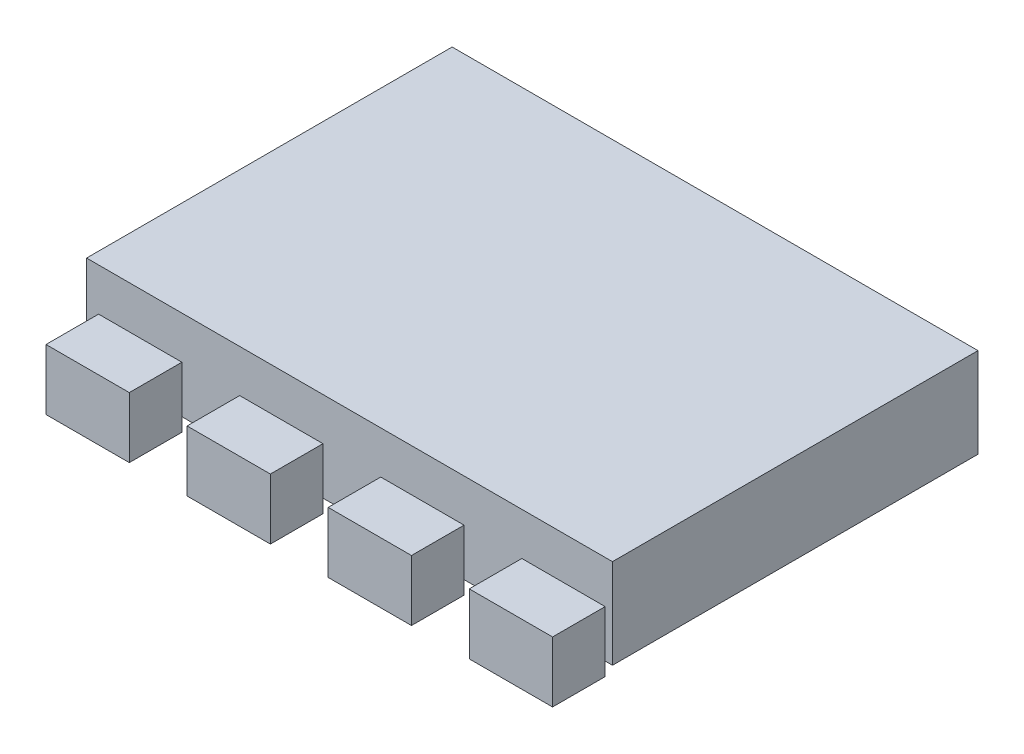
ISO-10303-21;
HEADER;
FILE_DESCRIPTION(('STEP AP214'),'2;1');
FILE_NAME('part.step','',(''),(''),'','','');
FILE_SCHEMA(('AUTOMOTIVE_DESIGN { 1 0 10303 214 1 1 1 1 }'));
ENDSEC;
DATA;
#1=APPLICATION_CONTEXT('core data for automotive mechanical design processes');
#2=APPLICATION_PROTOCOL_DEFINITION('international standard','automotive_design',2000,#1);
#3=PRODUCT_CONTEXT('',#1,'mechanical');
#4=PRODUCT('Part','Part','',(#3));
#5=PRODUCT_RELATED_PRODUCT_CATEGORY('part','',(#4));
#6=PRODUCT_DEFINITION_FORMATION('','',#4);
#7=PRODUCT_DEFINITION_CONTEXT('part definition',#1,'design');
#8=PRODUCT_DEFINITION('design','',#6,#7);
#9=PRODUCT_DEFINITION_SHAPE('','',#8);
#10=(LENGTH_UNIT() NAMED_UNIT(*) SI_UNIT(.MILLI.,.METRE.));
#11=(NAMED_UNIT(*) PLANE_ANGLE_UNIT() SI_UNIT($,.RADIAN.));
#12=(NAMED_UNIT(*) SI_UNIT($,.STERADIAN.) SOLID_ANGLE_UNIT());
#13=UNCERTAINTY_MEASURE_WITH_UNIT(LENGTH_MEASURE(1.E-05),#10,'distance_accuracy_value','');
#14=(GEOMETRIC_REPRESENTATION_CONTEXT(3) GLOBAL_UNCERTAINTY_ASSIGNED_CONTEXT((#13)) GLOBAL_UNIT_ASSIGNED_CONTEXT((#10,
#11,#12)) REPRESENTATION_CONTEXT('',''));
#15=CARTESIAN_POINT('',(0.,0.,0.));
#16=DIRECTION('',(0.,0.,1.));
#17=DIRECTION('',(1.,0.,0.));
#18=AXIS2_PLACEMENT_3D('',#15,#16,#17);
#19=CARTESIAN_POINT('',(-41.,14.,28.5));
#20=DIRECTION('',(0.,0.,-1.));
#21=DIRECTION('',(-1.,0.,0.));
#22=AXIS2_PLACEMENT_3D('',#19,#20,#21);
#23=PLANE('',#22);
#24=DIRECTION('',(0.,1.,0.));
#25=VECTOR('',#24,1.);
#26=CARTESIAN_POINT('',(39.8599380478354,-2.10091113978716,28.5));
#27=LINE('',#26,#25);
#28=CARTESIAN_POINT('',(39.8599380478354,0.,28.5));
#29=VERTEX_POINT('',#28);
#30=CARTESIAN_POINT('',(39.8599380478354,7.36082907602701,28.5));
#31=VERTEX_POINT('',#30);
#32=EDGE_CURVE('E223',#29,#31,#27,.T.);
#33=ORIENTED_EDGE('',*,*,#32,.F.);
#34=DIRECTION('',(1.,0.,0.));
#35=VECTOR('',#34,1.);
#36=CARTESIAN_POINT('',(-41.,0.,28.5));
#37=LINE('',#36,#35);
#38=CARTESIAN_POINT('',(41.,0.,28.5));
#39=VERTEX_POINT('',#38);
#40=EDGE_CURVE('E347',#29,#39,#37,.T.);
#41=ORIENTED_EDGE('',*,*,#40,.T.);
#42=DIRECTION('',(0.,-1.,0.));
#43=VECTOR('',#42,1.);
#44=CARTESIAN_POINT('',(41.,14.,28.5));
#45=LINE('',#44,#43);
#46=CARTESIAN_POINT('',(41.,14.,28.5));
#47=VERTEX_POINT('',#46);
#48=EDGE_CURVE('E340',#47,#39,#45,.T.);
#49=ORIENTED_EDGE('',*,*,#48,.F.);
#50=DIRECTION('',(1.,0.,0.));
#51=VECTOR('',#50,1.);
#52=CARTESIAN_POINT('',(-41.,14.,28.5));
#53=LINE('',#52,#51);
#54=CARTESIAN_POINT('',(-41.,14.,28.5));
#55=VERTEX_POINT('',#54);
#56=EDGE_CURVE('E338',#55,#47,#53,.T.);
#57=ORIENTED_EDGE('',*,*,#56,.F.);
#58=DIRECTION('',(0.,-1.,0.));
#59=VECTOR('',#58,1.);
#60=CARTESIAN_POINT('',(-41.,14.,28.5));
#61=LINE('',#60,#59);
#62=CARTESIAN_POINT('',(-41.,0.,28.5));
#63=VERTEX_POINT('',#62);
#64=EDGE_CURVE('E353',#55,#63,#61,.T.);
#65=ORIENTED_EDGE('',*,*,#64,.T.);
#66=CARTESIAN_POINT('',(-39.1299086891298,0.,28.5));
#67=VERTEX_POINT('',#66);
#68=EDGE_CURVE('E334',#63,#67,#37,.T.);
#69=ORIENTED_EDGE('',*,*,#68,.T.);
#70=DIRECTION('',(0.,-1.,0.));
#71=VECTOR('',#70,1.);
#72=CARTESIAN_POINT('',(-39.1299086891298,-2.10091113978716,28.5));
#73=LINE('',#72,#71);
#74=CARTESIAN_POINT('',(-39.1299086891298,7.36082907602701,28.5));
#75=VERTEX_POINT('',#74);
#76=EDGE_CURVE('E314',#75,#67,#73,.T.);
#77=ORIENTED_EDGE('',*,*,#76,.F.);
#78=DIRECTION('',(-1.,0.,0.));
#79=VECTOR('',#78,1.);
#80=CARTESIAN_POINT('',(-39.1299086891298,7.36082907602701,28.5));
#81=LINE('',#80,#79);
#82=CARTESIAN_POINT('',(-26.1400619521646,7.36082907602701,28.5));
#83=VERTEX_POINT('',#82);
#84=EDGE_CURVE('E310',#83,#75,#81,.T.);
#85=ORIENTED_EDGE('',*,*,#84,.F.);
#86=DIRECTION('',(0.,1.,0.));
#87=VECTOR('',#86,1.);
#88=CARTESIAN_POINT('',(-26.1400619521646,-2.10091113978716,28.5));
#89=LINE('',#88,#87);
#90=CARTESIAN_POINT('',(-26.1400619521646,0.,28.5));
#91=VERTEX_POINT('',#90);
#92=EDGE_CURVE('E11',#91,#83,#89,.T.);
#93=ORIENTED_EDGE('',*,*,#92,.F.);
#94=CARTESIAN_POINT('',(-17.1299086891298,0.,28.5));
#95=VERTEX_POINT('',#94);
#96=EDGE_CURVE('E716',#91,#95,#37,.T.);
#97=ORIENTED_EDGE('',*,*,#96,.T.);
#98=DIRECTION('',(0.,-1.,0.));
#99=VECTOR('',#98,1.);
#100=CARTESIAN_POINT('',(-17.1299086891298,-2.10091113978716,28.5));
#101=LINE('',#100,#99);
#102=CARTESIAN_POINT('',(-17.1299086891298,7.36082907602701,28.5));
#103=VERTEX_POINT('',#102);
#104=EDGE_CURVE('E283',#103,#95,#101,.T.);
#105=ORIENTED_EDGE('',*,*,#104,.F.);
#106=DIRECTION('',(-1.,0.,0.));
#107=VECTOR('',#106,1.);
#108=CARTESIAN_POINT('',(-17.1299086891298,7.36082907602701,28.5));
#109=LINE('',#108,#107);
#110=CARTESIAN_POINT('',(-4.14006195216458,7.36082907602701,28.5));
#111=VERTEX_POINT('',#110);
#112=EDGE_CURVE('E279',#111,#103,#109,.T.);
#113=ORIENTED_EDGE('',*,*,#112,.F.);
#114=DIRECTION('',(0.,1.,0.));
#115=VECTOR('',#114,1.);
#116=CARTESIAN_POINT('',(-4.14006195216458,-2.10091113978716,28.5));
#117=LINE('',#116,#115);
#118=CARTESIAN_POINT('',(-4.14006195216458,0.,28.5));
#119=VERTEX_POINT('',#118);
#120=EDGE_CURVE('E264',#119,#111,#117,.T.);
#121=ORIENTED_EDGE('',*,*,#120,.F.);
#122=CARTESIAN_POINT('',(4.8700913108702,0.,28.5));
#123=VERTEX_POINT('',#122);
#124=EDGE_CURVE('E709',#119,#123,#37,.T.);
#125=ORIENTED_EDGE('',*,*,#124,.T.);
#126=DIRECTION('',(0.,-1.,0.));
#127=VECTOR('',#126,1.);
#128=CARTESIAN_POINT('',(4.8700913108702,-2.10091113978716,28.5));
#129=LINE('',#128,#127);
#130=CARTESIAN_POINT('',(4.8700913108702,7.36082907602701,28.5));
#131=VERTEX_POINT('',#130);
#132=EDGE_CURVE('E249',#131,#123,#129,.T.);
#133=ORIENTED_EDGE('',*,*,#132,.F.);
#134=DIRECTION('',(-1.,0.,0.));
#135=VECTOR('',#134,1.);
#136=CARTESIAN_POINT('',(4.8700913108702,7.36082907602701,28.5));
#137=LINE('',#136,#135);
#138=CARTESIAN_POINT('',(17.8599380478354,7.36082907602701,28.5));
#139=VERTEX_POINT('',#138);
#140=EDGE_CURVE('E245',#139,#131,#137,.T.);
#141=ORIENTED_EDGE('',*,*,#140,.F.);
#142=DIRECTION('',(0.,1.,0.));
#143=VECTOR('',#142,1.);
#144=CARTESIAN_POINT('',(17.8599380478354,-2.10091113978716,28.5));
#145=LINE('',#144,#143);
#146=CARTESIAN_POINT('',(17.8599380478354,0.,28.5));
#147=VERTEX_POINT('',#146);
#148=EDGE_CURVE('E224',#147,#139,#145,.T.);
#149=ORIENTED_EDGE('',*,*,#148,.F.);
#150=CARTESIAN_POINT('',(26.8700913108702,0.,28.5));
#151=VERTEX_POINT('',#150);
#152=EDGE_CURVE('E705',#147,#151,#37,.T.);
#153=ORIENTED_EDGE('',*,*,#152,.T.);
#154=DIRECTION('',(0.,-1.,0.));
#155=VECTOR('',#154,1.);
#156=CARTESIAN_POINT('',(26.8700913108702,-2.10091113978716,28.5));
#157=LINE('',#156,#155);
#158=CARTESIAN_POINT('',(26.8700913108702,7.36082907602701,28.5));
#159=VERTEX_POINT('',#158);
#160=EDGE_CURVE('E59',#159,#151,#157,.T.);
#161=ORIENTED_EDGE('',*,*,#160,.F.);
#162=DIRECTION('',(-1.,0.,0.));
#163=VECTOR('',#162,1.);
#164=CARTESIAN_POINT('',(26.8700913108702,7.36082907602701,28.5));
#165=LINE('',#164,#163);
#166=EDGE_CURVE('E54',#31,#159,#165,.T.);
#167=ORIENTED_EDGE('',*,*,#166,.F.);
#168=EDGE_LOOP('',(#33,#41,#49,#57,#65,#69,#77,#85,#93,#97,#105,#113,#121,#125,#133,#141,#149,
#153,#161,#167));
#169=FACE_BOUND('',#168,.T.);
#170=ADVANCED_FACE('F37',(#169),#23,.F.);
#171=CARTESIAN_POINT('',(41.,14.,28.5));
#172=DIRECTION('',(-1.,0.,0.));
#173=DIRECTION('',(0.,0.,1.));
#174=AXIS2_PLACEMENT_3D('',#171,#172,#173);
#175=PLANE('',#174);
#176=DIRECTION('',(0.,0.,-1.));
#177=VECTOR('',#176,1.);
#178=CARTESIAN_POINT('',(41.,0.,28.5));
#179=LINE('',#178,#177);
#180=CARTESIAN_POINT('',(41.,0.,-28.5));
#181=VERTEX_POINT('',#180);
#182=EDGE_CURVE('E329',#39,#181,#179,.T.);
#183=ORIENTED_EDGE('',*,*,#182,.T.);
#184=DIRECTION('',(0.,-1.,0.));
#185=VECTOR('',#184,1.);
#186=CARTESIAN_POINT('',(41.,14.,-28.5));
#187=LINE('',#186,#185);
#188=CARTESIAN_POINT('',(41.,14.,-28.5));
#189=VERTEX_POINT('',#188);
#190=EDGE_CURVE('E41',#189,#181,#187,.T.);
#191=ORIENTED_EDGE('',*,*,#190,.F.);
#192=DIRECTION('',(0.,0.,-1.));
#193=VECTOR('',#192,1.);
#194=CARTESIAN_POINT('',(41.,14.,28.5));
#195=LINE('',#194,#193);
#196=EDGE_CURVE('E330',#47,#189,#195,.T.);
#197=ORIENTED_EDGE('',*,*,#196,.F.);
#198=ORIENTED_EDGE('',*,*,#48,.T.);
#199=EDGE_LOOP('',(#183,#191,#197,#198));
#200=FACE_BOUND('',#199,.T.);
#201=ADVANCED_FACE('F39',(#200),#175,.F.);
#202=CARTESIAN_POINT('',(-41.,14.,-28.5));
#203=DIRECTION('',(0.,0.,1.));
#204=DIRECTION('',(1.,0.,0.));
#205=AXIS2_PLACEMENT_3D('',#202,#203,#204);
#206=PLANE('',#205);
#207=DIRECTION('',(-1.,0.,0.));
#208=VECTOR('',#207,1.);
#209=CARTESIAN_POINT('',(-41.,0.,-28.5));
#210=LINE('',#209,#208);
#211=CARTESIAN_POINT('',(-41.,0.,-28.5));
#212=VERTEX_POINT('',#211);
#213=EDGE_CURVE('E343',#181,#212,#210,.T.);
#214=ORIENTED_EDGE('',*,*,#213,.T.);
#215=DIRECTION('',(0.,-1.,0.));
#216=VECTOR('',#215,1.);
#217=CARTESIAN_POINT('',(-41.,14.,-28.5));
#218=LINE('',#217,#216);
#219=CARTESIAN_POINT('',(-41.,14.,-28.5));
#220=VERTEX_POINT('',#219);
#221=EDGE_CURVE('E355',#220,#212,#218,.T.);
#222=ORIENTED_EDGE('',*,*,#221,.F.);
#223=DIRECTION('',(-1.,0.,0.));
#224=VECTOR('',#223,1.);
#225=CARTESIAN_POINT('',(-41.,14.,-28.5));
#226=LINE('',#225,#224);
#227=EDGE_CURVE('E333',#189,#220,#226,.T.);
#228=ORIENTED_EDGE('',*,*,#227,.F.);
#229=ORIENTED_EDGE('',*,*,#190,.T.);
#230=EDGE_LOOP('',(#214,#222,#228,#229));
#231=FACE_BOUND('',#230,.T.);
#232=ADVANCED_FACE('F364',(#231),#206,.F.);
#233=CARTESIAN_POINT('',(-41.,14.,28.5));
#234=DIRECTION('',(1.,0.,0.));
#235=DIRECTION('',(0.,0.,-1.));
#236=AXIS2_PLACEMENT_3D('',#233,#234,#235);
#237=PLANE('',#236);
#238=DIRECTION('',(0.,0.,1.));
#239=VECTOR('',#238,1.);
#240=CARTESIAN_POINT('',(-41.,0.,28.5));
#241=LINE('',#240,#239);
#242=EDGE_CURVE('E345',#212,#63,#241,.T.);
#243=ORIENTED_EDGE('',*,*,#242,.T.);
#244=ORIENTED_EDGE('',*,*,#64,.F.);
#245=DIRECTION('',(0.,0.,1.));
#246=VECTOR('',#245,1.);
#247=CARTESIAN_POINT('',(-41.,14.,28.5));
#248=LINE('',#247,#246);
#249=EDGE_CURVE('E336',#220,#55,#248,.T.);
#250=ORIENTED_EDGE('',*,*,#249,.F.);
#251=ORIENTED_EDGE('',*,*,#221,.T.);
#252=EDGE_LOOP('',(#243,#244,#250,#251));
#253=FACE_BOUND('',#252,.T.);
#254=ADVANCED_FACE('F373',(#253),#237,.F.);
#255=CARTESIAN_POINT('',(0.,14.,0.));
#256=DIRECTION('',(0.,-1.,0.));
#257=DIRECTION('',(0.,0.,-1.));
#258=AXIS2_PLACEMENT_3D('',#255,#256,#257);
#259=PLANE('',#258);
#260=ORIENTED_EDGE('',*,*,#196,.T.);
#261=ORIENTED_EDGE('',*,*,#227,.T.);
#262=ORIENTED_EDGE('',*,*,#249,.T.);
#263=ORIENTED_EDGE('',*,*,#56,.T.);
#264=EDGE_LOOP('',(#260,#261,#262,#263));
#265=FACE_BOUND('',#264,.T.);
#266=ADVANCED_FACE('F377',(#265),#259,.F.);
#267=CARTESIAN_POINT('',(0.,0.,0.));
#268=DIRECTION('',(0.,-1.,0.));
#269=DIRECTION('',(0.,0.,-1.));
#270=AXIS2_PLACEMENT_3D('',#267,#268,#269);
#271=PLANE('',#270);
#272=ORIENTED_EDGE('',*,*,#182,.F.);
#273=ORIENTED_EDGE('',*,*,#40,.F.);
#274=EDGE_CURVE('E693',#151,#29,#37,.T.);
#275=ORIENTED_EDGE('',*,*,#274,.F.);
#276=ORIENTED_EDGE('',*,*,#152,.F.);
#277=EDGE_CURVE('E706',#123,#147,#37,.T.);
#278=ORIENTED_EDGE('',*,*,#277,.F.);
#279=ORIENTED_EDGE('',*,*,#124,.F.);
#280=EDGE_CURVE('E713',#95,#119,#37,.T.);
#281=ORIENTED_EDGE('',*,*,#280,.F.);
#282=ORIENTED_EDGE('',*,*,#96,.F.);
#283=EDGE_CURVE('E350',#67,#91,#37,.T.);
#284=ORIENTED_EDGE('',*,*,#283,.F.);
#285=ORIENTED_EDGE('',*,*,#68,.F.);
#286=ORIENTED_EDGE('',*,*,#242,.F.);
#287=ORIENTED_EDGE('',*,*,#213,.F.);
#288=EDGE_LOOP('',(#272,#273,#275,#276,#278,#279,#281,#282,#284,#285,#286,#287));
#289=FACE_BOUND('',#288,.T.);
#290=ADVANCED_FACE('F370',(#289),#271,.T.);
#291=CARTESIAN_POINT('',(-26.1400619521646,-2.10091113978716,36.7));
#292=DIRECTION('',(-1.,0.,0.));
#293=DIRECTION('',(0.,0.,1.));
#294=AXIS2_PLACEMENT_3D('',#291,#292,#293);
#295=PLANE('',#294);
#296=CARTESIAN_POINT('',(-26.1400619521646,-2.10091113978716,28.5));
#297=VERTEX_POINT('',#296);
#298=EDGE_CURVE('E47',#297,#91,#89,.T.);
#299=ORIENTED_EDGE('',*,*,#298,.T.);
#300=ORIENTED_EDGE('',*,*,#92,.T.);
#301=DIRECTION('',(0.,0.,-1.));
#302=VECTOR('',#301,1.);
#303=CARTESIAN_POINT('',(-26.1400619521646,7.36082907602701,36.7));
#304=LINE('',#303,#302);
#305=CARTESIAN_POINT('',(-26.1400619521646,7.36082907602701,36.7));
#306=VERTEX_POINT('',#305);
#307=EDGE_CURVE('E326',#306,#83,#304,.T.);
#308=ORIENTED_EDGE('',*,*,#307,.F.);
#309=DIRECTION('',(0.,1.,0.));
#310=VECTOR('',#309,1.);
#311=CARTESIAN_POINT('',(-26.1400619521646,-2.10091113978716,36.7));
#312=LINE('',#311,#310);
#313=CARTESIAN_POINT('',(-26.1400619521646,-2.10091113978716,36.7));
#314=VERTEX_POINT('',#313);
#315=EDGE_CURVE('E298',#314,#306,#312,.T.);
#316=ORIENTED_EDGE('',*,*,#315,.F.);
#317=DIRECTION('',(0.,0.,-1.));
#318=VECTOR('',#317,1.);
#319=CARTESIAN_POINT('',(-26.1400619521646,-2.10091113978716,36.7));
#320=LINE('',#319,#318);
#321=EDGE_CURVE('E307',#314,#297,#320,.T.);
#322=ORIENTED_EDGE('',*,*,#321,.T.);
#323=EDGE_LOOP('',(#299,#300,#308,#316,#322));
#324=FACE_BOUND('',#323,.T.);
#325=ADVANCED_FACE('F385',(#324),#295,.F.);
#326=CARTESIAN_POINT('',(-39.1299086891298,7.36082907602701,36.7));
#327=DIRECTION('',(0.,-1.,0.));
#328=DIRECTION('',(0.,0.,-1.));
#329=AXIS2_PLACEMENT_3D('',#326,#327,#328);
#330=PLANE('',#329);
#331=ORIENTED_EDGE('',*,*,#84,.T.);
#332=DIRECTION('',(0.,0.,-1.));
#333=VECTOR('',#332,1.);
#334=CARTESIAN_POINT('',(-39.1299086891298,7.36082907602701,36.7));
#335=LINE('',#334,#333);
#336=CARTESIAN_POINT('',(-39.1299086891298,7.36082907602701,36.7));
#337=VERTEX_POINT('',#336);
#338=EDGE_CURVE('E323',#337,#75,#335,.T.);
#339=ORIENTED_EDGE('',*,*,#338,.F.);
#340=DIRECTION('',(-1.,0.,0.));
#341=VECTOR('',#340,1.);
#342=CARTESIAN_POINT('',(-39.1299086891298,7.36082907602701,36.7));
#343=LINE('',#342,#341);
#344=EDGE_CURVE('E301',#306,#337,#343,.T.);
#345=ORIENTED_EDGE('',*,*,#344,.F.);
#346=ORIENTED_EDGE('',*,*,#307,.T.);
#347=EDGE_LOOP('',(#331,#339,#345,#346));
#348=FACE_BOUND('',#347,.T.);
#349=ADVANCED_FACE('F418',(#348),#330,.F.);
#350=CARTESIAN_POINT('',(-39.1299086891298,-2.10091113978716,36.7));
#351=DIRECTION('',(1.,0.,0.));
#352=DIRECTION('',(0.,0.,-1.));
#353=AXIS2_PLACEMENT_3D('',#350,#351,#352);
#354=PLANE('',#353);
#355=ORIENTED_EDGE('',*,*,#76,.T.);
#356=CARTESIAN_POINT('',(-39.1299086891298,-2.10091113978716,28.5));
#357=VERTEX_POINT('',#356);
#358=EDGE_CURVE('E313',#67,#357,#73,.T.);
#359=ORIENTED_EDGE('',*,*,#358,.T.);
#360=DIRECTION('',(0.,0.,-1.));
#361=VECTOR('',#360,1.);
#362=CARTESIAN_POINT('',(-39.1299086891298,-2.10091113978716,36.7));
#363=LINE('',#362,#361);
#364=CARTESIAN_POINT('',(-39.1299086891298,-2.10091113978716,36.7));
#365=VERTEX_POINT('',#364);
#366=EDGE_CURVE('E320',#365,#357,#363,.T.);
#367=ORIENTED_EDGE('',*,*,#366,.F.);
#368=DIRECTION('',(0.,-1.,0.));
#369=VECTOR('',#368,1.);
#370=CARTESIAN_POINT('',(-39.1299086891298,-2.10091113978716,36.7));
#371=LINE('',#370,#369);
#372=EDGE_CURVE('E304',#337,#365,#371,.T.);
#373=ORIENTED_EDGE('',*,*,#372,.F.);
#374=ORIENTED_EDGE('',*,*,#338,.T.);
#375=EDGE_LOOP('',(#355,#359,#367,#373,#374));
#376=FACE_BOUND('',#375,.T.);
#377=ADVANCED_FACE('F427',(#376),#354,.F.);
#378=CARTESIAN_POINT('',(-39.1299086891298,-2.10091113978716,36.7));
#379=DIRECTION('',(0.,1.,0.));
#380=DIRECTION('',(0.,0.,1.));
#381=AXIS2_PLACEMENT_3D('',#378,#379,#380);
#382=PLANE('',#381);
#383=DIRECTION('',(1.,0.,0.));
#384=VECTOR('',#383,1.);
#385=CARTESIAN_POINT('',(-39.1299086891298,-2.10091113978716,28.5));
#386=LINE('',#385,#384);
#387=EDGE_CURVE('E302',#357,#297,#386,.T.);
#388=ORIENTED_EDGE('',*,*,#387,.T.);
#389=ORIENTED_EDGE('',*,*,#321,.F.);
#390=DIRECTION('',(1.,0.,0.));
#391=VECTOR('',#390,1.);
#392=CARTESIAN_POINT('',(-39.1299086891298,-2.10091113978716,36.7));
#393=LINE('',#392,#391);
#394=EDGE_CURVE('E306',#365,#314,#393,.T.);
#395=ORIENTED_EDGE('',*,*,#394,.F.);
#396=ORIENTED_EDGE('',*,*,#366,.T.);
#397=EDGE_LOOP('',(#388,#389,#395,#396));
#398=FACE_BOUND('',#397,.T.);
#399=ADVANCED_FACE('F437',(#398),#382,.F.);
#400=CARTESIAN_POINT('',(0.,0.,36.7));
#401=DIRECTION('',(0.,0.,-1.));
#402=DIRECTION('',(-1.,0.,0.));
#403=AXIS2_PLACEMENT_3D('',#400,#401,#402);
#404=PLANE('',#403);
#405=ORIENTED_EDGE('',*,*,#315,.T.);
#406=ORIENTED_EDGE('',*,*,#344,.T.);
#407=ORIENTED_EDGE('',*,*,#372,.T.);
#408=ORIENTED_EDGE('',*,*,#394,.T.);
#409=EDGE_LOOP('',(#405,#406,#407,#408));
#410=FACE_BOUND('',#409,.T.);
#411=ADVANCED_FACE('F447',(#410),#404,.F.);
#412=CARTESIAN_POINT('',(0.,0.,28.5));
#413=DIRECTION('',(0.,0.,-1.));
#414=DIRECTION('',(-1.,0.,0.));
#415=AXIS2_PLACEMENT_3D('',#412,#413,#414);
#416=PLANE('',#415);
#417=ORIENTED_EDGE('',*,*,#358,.F.);
#418=ORIENTED_EDGE('',*,*,#283,.T.);
#419=ORIENTED_EDGE('',*,*,#298,.F.);
#420=ORIENTED_EDGE('',*,*,#387,.F.);
#421=EDGE_LOOP('',(#417,#418,#419,#420));
#422=FACE_BOUND('',#421,.T.);
#423=ADVANCED_FACE('F456',(#422),#416,.T.);
#424=CARTESIAN_POINT('',(-4.14006195216458,-2.10091113978716,36.7));
#425=DIRECTION('',(-1.,0.,0.));
#426=DIRECTION('',(0.,0.,1.));
#427=AXIS2_PLACEMENT_3D('',#424,#425,#426);
#428=PLANE('',#427);
#429=CARTESIAN_POINT('',(-4.14006195216458,-2.10091113978716,28.5));
#430=VERTEX_POINT('',#429);
#431=EDGE_CURVE('E276',#430,#119,#117,.T.);
#432=ORIENTED_EDGE('',*,*,#431,.T.);
#433=ORIENTED_EDGE('',*,*,#120,.T.);
#434=DIRECTION('',(0.,0.,-1.));
#435=VECTOR('',#434,1.);
#436=CARTESIAN_POINT('',(-4.14006195216458,7.36082907602701,36.7));
#437=LINE('',#436,#435);
#438=CARTESIAN_POINT('',(-4.14006195216458,7.36082907602701,36.7));
#439=VERTEX_POINT('',#438);
#440=EDGE_CURVE('E295',#439,#111,#437,.T.);
#441=ORIENTED_EDGE('',*,*,#440,.F.);
#442=DIRECTION('',(0.,1.,0.));
#443=VECTOR('',#442,1.);
#444=CARTESIAN_POINT('',(-4.14006195216458,-2.10091113978716,36.7));
#445=LINE('',#444,#443);
#446=CARTESIAN_POINT('',(-4.14006195216458,-2.10091113978716,36.7));
#447=VERTEX_POINT('',#446);
#448=EDGE_CURVE('E265',#447,#439,#445,.T.);
#449=ORIENTED_EDGE('',*,*,#448,.F.);
#450=DIRECTION('',(0.,0.,-1.));
#451=VECTOR('',#450,1.);
#452=CARTESIAN_POINT('',(-4.14006195216458,-2.10091113978716,36.7));
#453=LINE('',#452,#451);
#454=EDGE_CURVE('E275',#447,#430,#453,.T.);
#455=ORIENTED_EDGE('',*,*,#454,.T.);
#456=EDGE_LOOP('',(#432,#433,#441,#449,#455));
#457=FACE_BOUND('',#456,.T.);
#458=ADVANCED_FACE('F465',(#457),#428,.F.);
#459=CARTESIAN_POINT('',(-17.1299086891298,7.36082907602701,36.7));
#460=DIRECTION('',(0.,-1.,0.));
#461=DIRECTION('',(0.,0.,-1.));
#462=AXIS2_PLACEMENT_3D('',#459,#460,#461);
#463=PLANE('',#462);
#464=ORIENTED_EDGE('',*,*,#112,.T.);
#465=DIRECTION('',(0.,0.,-1.));
#466=VECTOR('',#465,1.);
#467=CARTESIAN_POINT('',(-17.1299086891298,7.36082907602701,36.7));
#468=LINE('',#467,#466);
#469=CARTESIAN_POINT('',(-17.1299086891298,7.36082907602701,36.7));
#470=VERTEX_POINT('',#469);
#471=EDGE_CURVE('E292',#470,#103,#468,.T.);
#472=ORIENTED_EDGE('',*,*,#471,.F.);
#473=DIRECTION('',(-1.,0.,0.));
#474=VECTOR('',#473,1.);
#475=CARTESIAN_POINT('',(-17.1299086891298,7.36082907602701,36.7));
#476=LINE('',#475,#474);
#477=EDGE_CURVE('E268',#439,#470,#476,.T.);
#478=ORIENTED_EDGE('',*,*,#477,.F.);
#479=ORIENTED_EDGE('',*,*,#440,.T.);
#480=EDGE_LOOP('',(#464,#472,#478,#479));
#481=FACE_BOUND('',#480,.T.);
#482=ADVANCED_FACE('F476',(#481),#463,.F.);
#483=CARTESIAN_POINT('',(-17.1299086891298,-2.10091113978716,36.7));
#484=DIRECTION('',(1.,0.,0.));
#485=DIRECTION('',(0.,0.,-1.));
#486=AXIS2_PLACEMENT_3D('',#483,#484,#485);
#487=PLANE('',#486);
#488=ORIENTED_EDGE('',*,*,#104,.T.);
#489=CARTESIAN_POINT('',(-17.1299086891298,-2.10091113978716,28.5));
#490=VERTEX_POINT('',#489);
#491=EDGE_CURVE('E282',#95,#490,#101,.T.);
#492=ORIENTED_EDGE('',*,*,#491,.T.);
#493=DIRECTION('',(0.,0.,-1.));
#494=VECTOR('',#493,1.);
#495=CARTESIAN_POINT('',(-17.1299086891298,-2.10091113978716,36.7));
#496=LINE('',#495,#494);
#497=CARTESIAN_POINT('',(-17.1299086891298,-2.10091113978716,36.7));
#498=VERTEX_POINT('',#497);
#499=EDGE_CURVE('E289',#498,#490,#496,.T.);
#500=ORIENTED_EDGE('',*,*,#499,.F.);
#501=DIRECTION('',(0.,-1.,0.));
#502=VECTOR('',#501,1.);
#503=CARTESIAN_POINT('',(-17.1299086891298,-2.10091113978716,36.7));
#504=LINE('',#503,#502);
#505=EDGE_CURVE('E271',#470,#498,#504,.T.);
#506=ORIENTED_EDGE('',*,*,#505,.F.);
#507=ORIENTED_EDGE('',*,*,#471,.T.);
#508=EDGE_LOOP('',(#488,#492,#500,#506,#507));
#509=FACE_BOUND('',#508,.T.);
#510=ADVANCED_FACE('F485',(#509),#487,.F.);
#511=CARTESIAN_POINT('',(-17.1299086891298,-2.10091113978716,36.7));
#512=DIRECTION('',(0.,1.,0.));
#513=DIRECTION('',(0.,0.,1.));
#514=AXIS2_PLACEMENT_3D('',#511,#512,#513);
#515=PLANE('',#514);
#516=DIRECTION('',(1.,0.,0.));
#517=VECTOR('',#516,1.);
#518=CARTESIAN_POINT('',(-17.1299086891298,-2.10091113978716,28.5));
#519=LINE('',#518,#517);
#520=EDGE_CURVE('E269',#490,#430,#519,.T.);
#521=ORIENTED_EDGE('',*,*,#520,.T.);
#522=ORIENTED_EDGE('',*,*,#454,.F.);
#523=DIRECTION('',(1.,0.,0.));
#524=VECTOR('',#523,1.);
#525=CARTESIAN_POINT('',(-17.1299086891298,-2.10091113978716,36.7));
#526=LINE('',#525,#524);
#527=EDGE_CURVE('E273',#498,#447,#526,.T.);
#528=ORIENTED_EDGE('',*,*,#527,.F.);
#529=ORIENTED_EDGE('',*,*,#499,.T.);
#530=EDGE_LOOP('',(#521,#522,#528,#529));
#531=FACE_BOUND('',#530,.T.);
#532=ADVANCED_FACE('F495',(#531),#515,.F.);
#533=CARTESIAN_POINT('',(22.,0.,36.7));
#534=DIRECTION('',(0.,0.,-1.));
#535=DIRECTION('',(-1.,0.,0.));
#536=AXIS2_PLACEMENT_3D('',#533,#534,#535);
#537=PLANE('',#536);
#538=ORIENTED_EDGE('',*,*,#448,.T.);
#539=ORIENTED_EDGE('',*,*,#477,.T.);
#540=ORIENTED_EDGE('',*,*,#505,.T.);
#541=ORIENTED_EDGE('',*,*,#527,.T.);
#542=EDGE_LOOP('',(#538,#539,#540,#541));
#543=FACE_BOUND('',#542,.T.);
#544=ADVANCED_FACE('F505',(#543),#537,.F.);
#545=CARTESIAN_POINT('',(22.,0.,28.5));
#546=DIRECTION('',(0.,0.,-1.));
#547=DIRECTION('',(-1.,0.,0.));
#548=AXIS2_PLACEMENT_3D('',#545,#546,#547);
#549=PLANE('',#548);
#550=ORIENTED_EDGE('',*,*,#491,.F.);
#551=ORIENTED_EDGE('',*,*,#280,.T.);
#552=ORIENTED_EDGE('',*,*,#431,.F.);
#553=ORIENTED_EDGE('',*,*,#520,.F.);
#554=EDGE_LOOP('',(#550,#551,#552,#553));
#555=FACE_BOUND('',#554,.T.);
#556=ADVANCED_FACE('F515',(#555),#549,.T.);
#557=CARTESIAN_POINT('',(17.8599380478354,-2.10091113978716,36.7));
#558=DIRECTION('',(-1.,0.,0.));
#559=DIRECTION('',(0.,0.,1.));
#560=AXIS2_PLACEMENT_3D('',#557,#558,#559);
#561=PLANE('',#560);
#562=CARTESIAN_POINT('',(17.8599380478354,-2.10091113978716,28.5));
#563=VERTEX_POINT('',#562);
#564=EDGE_CURVE('E227',#563,#147,#145,.T.);
#565=ORIENTED_EDGE('',*,*,#564,.T.);
#566=ORIENTED_EDGE('',*,*,#148,.T.);
#567=DIRECTION('',(0.,0.,-1.));
#568=VECTOR('',#567,1.);
#569=CARTESIAN_POINT('',(17.8599380478354,7.36082907602701,36.7));
#570=LINE('',#569,#568);
#571=CARTESIAN_POINT('',(17.8599380478354,7.36082907602701,36.7));
#572=VERTEX_POINT('',#571);
#573=EDGE_CURVE('E261',#572,#139,#570,.T.);
#574=ORIENTED_EDGE('',*,*,#573,.F.);
#575=DIRECTION('',(0.,1.,0.));
#576=VECTOR('',#575,1.);
#577=CARTESIAN_POINT('',(17.8599380478354,-2.10091113978716,36.7));
#578=LINE('',#577,#576);
#579=CARTESIAN_POINT('',(17.8599380478354,-2.10091113978716,36.7));
#580=VERTEX_POINT('',#579);
#581=EDGE_CURVE('E233',#580,#572,#578,.T.);
#582=ORIENTED_EDGE('',*,*,#581,.F.);
#583=DIRECTION('',(0.,0.,-1.));
#584=VECTOR('',#583,1.);
#585=CARTESIAN_POINT('',(17.8599380478354,-2.10091113978716,36.7));
#586=LINE('',#585,#584);
#587=EDGE_CURVE('E242',#580,#563,#586,.T.);
#588=ORIENTED_EDGE('',*,*,#587,.T.);
#589=EDGE_LOOP('',(#565,#566,#574,#582,#588));
#590=FACE_BOUND('',#589,.T.);
#591=ADVANCED_FACE('F524',(#590),#561,.F.);
#592=CARTESIAN_POINT('',(4.8700913108702,7.36082907602701,36.7));
#593=DIRECTION('',(0.,-1.,0.));
#594=DIRECTION('',(0.,0.,-1.));
#595=AXIS2_PLACEMENT_3D('',#592,#593,#594);
#596=PLANE('',#595);
#597=ORIENTED_EDGE('',*,*,#140,.T.);
#598=DIRECTION('',(0.,0.,-1.));
#599=VECTOR('',#598,1.);
#600=CARTESIAN_POINT('',(4.8700913108702,7.36082907602701,36.7));
#601=LINE('',#600,#599);
#602=CARTESIAN_POINT('',(4.8700913108702,7.36082907602701,36.7));
#603=VERTEX_POINT('',#602);
#604=EDGE_CURVE('E258',#603,#131,#601,.T.);
#605=ORIENTED_EDGE('',*,*,#604,.F.);
#606=DIRECTION('',(-1.,0.,0.));
#607=VECTOR('',#606,1.);
#608=CARTESIAN_POINT('',(4.8700913108702,7.36082907602701,36.7));
#609=LINE('',#608,#607);
#610=EDGE_CURVE('E236',#572,#603,#609,.T.);
#611=ORIENTED_EDGE('',*,*,#610,.F.);
#612=ORIENTED_EDGE('',*,*,#573,.T.);
#613=EDGE_LOOP('',(#597,#605,#611,#612));
#614=FACE_BOUND('',#613,.T.);
#615=ADVANCED_FACE('F532',(#614),#596,.F.);
#616=CARTESIAN_POINT('',(4.8700913108702,-2.10091113978716,36.7));
#617=DIRECTION('',(1.,0.,0.));
#618=DIRECTION('',(0.,0.,-1.));
#619=AXIS2_PLACEMENT_3D('',#616,#617,#618);
#620=PLANE('',#619);
#621=ORIENTED_EDGE('',*,*,#132,.T.);
#622=CARTESIAN_POINT('',(4.8700913108702,-2.10091113978716,28.5));
#623=VERTEX_POINT('',#622);
#624=EDGE_CURVE('E248',#123,#623,#129,.T.);
#625=ORIENTED_EDGE('',*,*,#624,.T.);
#626=DIRECTION('',(0.,0.,-1.));
#627=VECTOR('',#626,1.);
#628=CARTESIAN_POINT('',(4.8700913108702,-2.10091113978716,36.7));
#629=LINE('',#628,#627);
#630=CARTESIAN_POINT('',(4.8700913108702,-2.10091113978716,36.7));
#631=VERTEX_POINT('',#630);
#632=EDGE_CURVE('E255',#631,#623,#629,.T.);
#633=ORIENTED_EDGE('',*,*,#632,.F.);
#634=DIRECTION('',(0.,-1.,0.));
#635=VECTOR('',#634,1.);
#636=CARTESIAN_POINT('',(4.8700913108702,-2.10091113978716,36.7));
#637=LINE('',#636,#635);
#638=EDGE_CURVE('E239',#603,#631,#637,.T.);
#639=ORIENTED_EDGE('',*,*,#638,.F.);
#640=ORIENTED_EDGE('',*,*,#604,.T.);
#641=EDGE_LOOP('',(#621,#625,#633,#639,#640));
#642=FACE_BOUND('',#641,.T.);
#643=ADVANCED_FACE('F539',(#642),#620,.F.);
#644=CARTESIAN_POINT('',(4.8700913108702,-2.10091113978716,36.7));
#645=DIRECTION('',(0.,1.,0.));
#646=DIRECTION('',(0.,0.,1.));
#647=AXIS2_PLACEMENT_3D('',#644,#645,#646);
#648=PLANE('',#647);
#649=DIRECTION('',(1.,0.,0.));
#650=VECTOR('',#649,1.);
#651=CARTESIAN_POINT('',(4.8700913108702,-2.10091113978716,28.5));
#652=LINE('',#651,#650);
#653=EDGE_CURVE('E237',#623,#563,#652,.T.);
#654=ORIENTED_EDGE('',*,*,#653,.T.);
#655=ORIENTED_EDGE('',*,*,#587,.F.);
#656=DIRECTION('',(1.,0.,0.));
#657=VECTOR('',#656,1.);
#658=CARTESIAN_POINT('',(4.8700913108702,-2.10091113978716,36.7));
#659=LINE('',#658,#657);
#660=EDGE_CURVE('E241',#631,#580,#659,.T.);
#661=ORIENTED_EDGE('',*,*,#660,.F.);
#662=ORIENTED_EDGE('',*,*,#632,.T.);
#663=EDGE_LOOP('',(#654,#655,#661,#662));
#664=FACE_BOUND('',#663,.T.);
#665=ADVANCED_FACE('F546',(#664),#648,.F.);
#666=CARTESIAN_POINT('',(44.,0.,36.7));
#667=DIRECTION('',(0.,0.,-1.));
#668=DIRECTION('',(-1.,0.,0.));
#669=AXIS2_PLACEMENT_3D('',#666,#667,#668);
#670=PLANE('',#669);
#671=ORIENTED_EDGE('',*,*,#581,.T.);
#672=ORIENTED_EDGE('',*,*,#610,.T.);
#673=ORIENTED_EDGE('',*,*,#638,.T.);
#674=ORIENTED_EDGE('',*,*,#660,.T.);
#675=EDGE_LOOP('',(#671,#672,#673,#674));
#676=FACE_BOUND('',#675,.T.);
#677=ADVANCED_FACE('F554',(#676),#670,.F.);
#678=CARTESIAN_POINT('',(44.,0.,28.5));
#679=DIRECTION('',(0.,0.,-1.));
#680=DIRECTION('',(-1.,0.,0.));
#681=AXIS2_PLACEMENT_3D('',#678,#679,#680);
#682=PLANE('',#681);
#683=ORIENTED_EDGE('',*,*,#624,.F.);
#684=ORIENTED_EDGE('',*,*,#277,.T.);
#685=ORIENTED_EDGE('',*,*,#564,.F.);
#686=ORIENTED_EDGE('',*,*,#653,.F.);
#687=EDGE_LOOP('',(#683,#684,#685,#686));
#688=FACE_BOUND('',#687,.T.);
#689=ADVANCED_FACE('F562',(#688),#682,.T.);
#690=CARTESIAN_POINT('',(39.8599380478354,-2.10091113978716,36.7));
#691=DIRECTION('',(-1.,0.,0.));
#692=DIRECTION('',(0.,0.,1.));
#693=AXIS2_PLACEMENT_3D('',#690,#691,#692);
#694=PLANE('',#693);
#695=CARTESIAN_POINT('',(39.8599380478354,-2.10091113978716,28.5));
#696=VERTEX_POINT('',#695);
#697=EDGE_CURVE('E704',#696,#29,#27,.T.);
#698=ORIENTED_EDGE('',*,*,#697,.T.);
#699=ORIENTED_EDGE('',*,*,#32,.T.);
#700=DIRECTION('',(0.,0.,-1.));
#701=VECTOR('',#700,1.);
#702=CARTESIAN_POINT('',(39.8599380478354,7.36082907602701,36.7));
#703=LINE('',#702,#701);
#704=CARTESIAN_POINT('',(39.8599380478354,7.36082907602701,36.7));
#705=VERTEX_POINT('',#704);
#706=EDGE_CURVE('E204',#705,#31,#703,.T.);
#707=ORIENTED_EDGE('',*,*,#706,.F.);
#708=DIRECTION('',(0.,1.,0.));
#709=VECTOR('',#708,1.);
#710=CARTESIAN_POINT('',(39.8599380478354,-2.10091113978716,36.7));
#711=LINE('',#710,#709);
#712=CARTESIAN_POINT('',(39.8599380478354,-2.10091113978716,36.7));
#713=VERTEX_POINT('',#712);
#714=EDGE_CURVE('E210',#713,#705,#711,.T.);
#715=ORIENTED_EDGE('',*,*,#714,.F.);
#716=DIRECTION('',(0.,0.,-1.));
#717=VECTOR('',#716,1.);
#718=CARTESIAN_POINT('',(39.8599380478354,-2.10091113978716,36.7));
#719=LINE('',#718,#717);
#720=EDGE_CURVE('E701',#713,#696,#719,.T.);
#721=ORIENTED_EDGE('',*,*,#720,.T.);
#722=EDGE_LOOP('',(#698,#699,#707,#715,#721));
#723=FACE_BOUND('',#722,.T.);
#724=ADVANCED_FACE('F222',(#723),#694,.F.);
#725=CARTESIAN_POINT('',(26.8700913108702,7.36082907602701,36.7));
#726=DIRECTION('',(0.,-1.,0.));
#727=DIRECTION('',(0.,0.,-1.));
#728=AXIS2_PLACEMENT_3D('',#725,#726,#727);
#729=PLANE('',#728);
#730=ORIENTED_EDGE('',*,*,#166,.T.);
#731=DIRECTION('',(0.,0.,-1.));
#732=VECTOR('',#731,1.);
#733=CARTESIAN_POINT('',(26.8700913108702,7.36082907602701,36.7));
#734=LINE('',#733,#732);
#735=CARTESIAN_POINT('',(26.8700913108702,7.36082907602701,36.7));
#736=VERTEX_POINT('',#735);
#737=EDGE_CURVE('E206',#736,#159,#734,.T.);
#738=ORIENTED_EDGE('',*,*,#737,.F.);
#739=DIRECTION('',(-1.,0.,0.));
#740=VECTOR('',#739,1.);
#741=CARTESIAN_POINT('',(26.8700913108702,7.36082907602701,36.7));
#742=LINE('',#741,#740);
#743=EDGE_CURVE('E200',#705,#736,#742,.T.);
#744=ORIENTED_EDGE('',*,*,#743,.F.);
#745=ORIENTED_EDGE('',*,*,#706,.T.);
#746=EDGE_LOOP('',(#730,#738,#744,#745));
#747=FACE_BOUND('',#746,.T.);
#748=ADVANCED_FACE('F202',(#747),#729,.F.);
#749=CARTESIAN_POINT('',(26.8700913108702,-2.10091113978716,36.7));
#750=DIRECTION('',(1.,0.,0.));
#751=DIRECTION('',(0.,0.,-1.));
#752=AXIS2_PLACEMENT_3D('',#749,#750,#751);
#753=PLANE('',#752);
#754=ORIENTED_EDGE('',*,*,#160,.T.);
#755=CARTESIAN_POINT('',(26.8700913108702,-2.10091113978716,28.5));
#756=VERTEX_POINT('',#755);
#757=EDGE_CURVE('E691',#151,#756,#157,.T.);
#758=ORIENTED_EDGE('',*,*,#757,.T.);
#759=DIRECTION('',(0.,0.,-1.));
#760=VECTOR('',#759,1.);
#761=CARTESIAN_POINT('',(26.8700913108702,-2.10091113978716,36.7));
#762=LINE('',#761,#760);
#763=CARTESIAN_POINT('',(26.8700913108702,-2.10091113978716,36.7));
#764=VERTEX_POINT('',#763);
#765=EDGE_CURVE('E229',#764,#756,#762,.T.);
#766=ORIENTED_EDGE('',*,*,#765,.F.);
#767=DIRECTION('',(0.,-1.,0.));
#768=VECTOR('',#767,1.);
#769=CARTESIAN_POINT('',(26.8700913108702,-2.10091113978716,36.7));
#770=LINE('',#769,#768);
#771=EDGE_CURVE('E209',#736,#764,#770,.T.);
#772=ORIENTED_EDGE('',*,*,#771,.F.);
#773=ORIENTED_EDGE('',*,*,#737,.T.);
#774=EDGE_LOOP('',(#754,#758,#766,#772,#773));
#775=FACE_BOUND('',#774,.T.);
#776=ADVANCED_FACE('F581',(#775),#753,.F.);
#777=CARTESIAN_POINT('',(26.8700913108702,-2.10091113978716,36.7));
#778=DIRECTION('',(0.,1.,0.));
#779=DIRECTION('',(0.,0.,1.));
#780=AXIS2_PLACEMENT_3D('',#777,#778,#779);
#781=PLANE('',#780);
#782=DIRECTION('',(1.,0.,0.));
#783=VECTOR('',#782,1.);
#784=CARTESIAN_POINT('',(26.8700913108702,-2.10091113978716,28.5));
#785=LINE('',#784,#783);
#786=EDGE_CURVE('E219',#756,#696,#785,.T.);
#787=ORIENTED_EDGE('',*,*,#786,.T.);
#788=ORIENTED_EDGE('',*,*,#720,.F.);
#789=DIRECTION('',(1.,0.,0.));
#790=VECTOR('',#789,1.);
#791=CARTESIAN_POINT('',(26.8700913108702,-2.10091113978716,36.7));
#792=LINE('',#791,#790);
#793=EDGE_CURVE('E215',#764,#713,#792,.T.);
#794=ORIENTED_EDGE('',*,*,#793,.F.);
#795=ORIENTED_EDGE('',*,*,#765,.T.);
#796=EDGE_LOOP('',(#787,#788,#794,#795));
#797=FACE_BOUND('',#796,.T.);
#798=ADVANCED_FACE('F587',(#797),#781,.F.);
#799=CARTESIAN_POINT('',(66.,0.,36.7));
#800=DIRECTION('',(0.,0.,-1.));
#801=DIRECTION('',(-1.,0.,0.));
#802=AXIS2_PLACEMENT_3D('',#799,#800,#801);
#803=PLANE('',#802);
#804=ORIENTED_EDGE('',*,*,#714,.T.);
#805=ORIENTED_EDGE('',*,*,#743,.T.);
#806=ORIENTED_EDGE('',*,*,#771,.T.);
#807=ORIENTED_EDGE('',*,*,#793,.T.);
#808=EDGE_LOOP('',(#804,#805,#806,#807));
#809=FACE_BOUND('',#808,.T.);
#810=ADVANCED_FACE('F213',(#809),#803,.F.);
#811=CARTESIAN_POINT('',(66.,0.,28.5));
#812=DIRECTION('',(0.,0.,-1.));
#813=DIRECTION('',(-1.,0.,0.));
#814=AXIS2_PLACEMENT_3D('',#811,#812,#813);
#815=PLANE('',#814);
#816=ORIENTED_EDGE('',*,*,#757,.F.);
#817=ORIENTED_EDGE('',*,*,#274,.T.);
#818=ORIENTED_EDGE('',*,*,#697,.F.);
#819=ORIENTED_EDGE('',*,*,#786,.F.);
#820=EDGE_LOOP('',(#816,#817,#818,#819));
#821=FACE_BOUND('',#820,.T.);
#822=ADVANCED_FACE('F600',(#821),#815,.T.);
#823=CLOSED_SHELL('',(#170,#201,#232,#254,#266,#290,#325,#349,#377,#399,#411,#423,#458,#482,
#510,#532,#544,#556,#591,#615,#643,#665,#677,#689,#724,#748,#776,#798,#810,#822));
#824=MANIFOLD_SOLID_BREP('B2',#823);
#825=ADVANCED_BREP_SHAPE_REPRESENTATION('',(#18,#824),#14);
#826=SHAPE_DEFINITION_REPRESENTATION(#9,#825);
ENDSEC;
END-ISO-10303-21;
